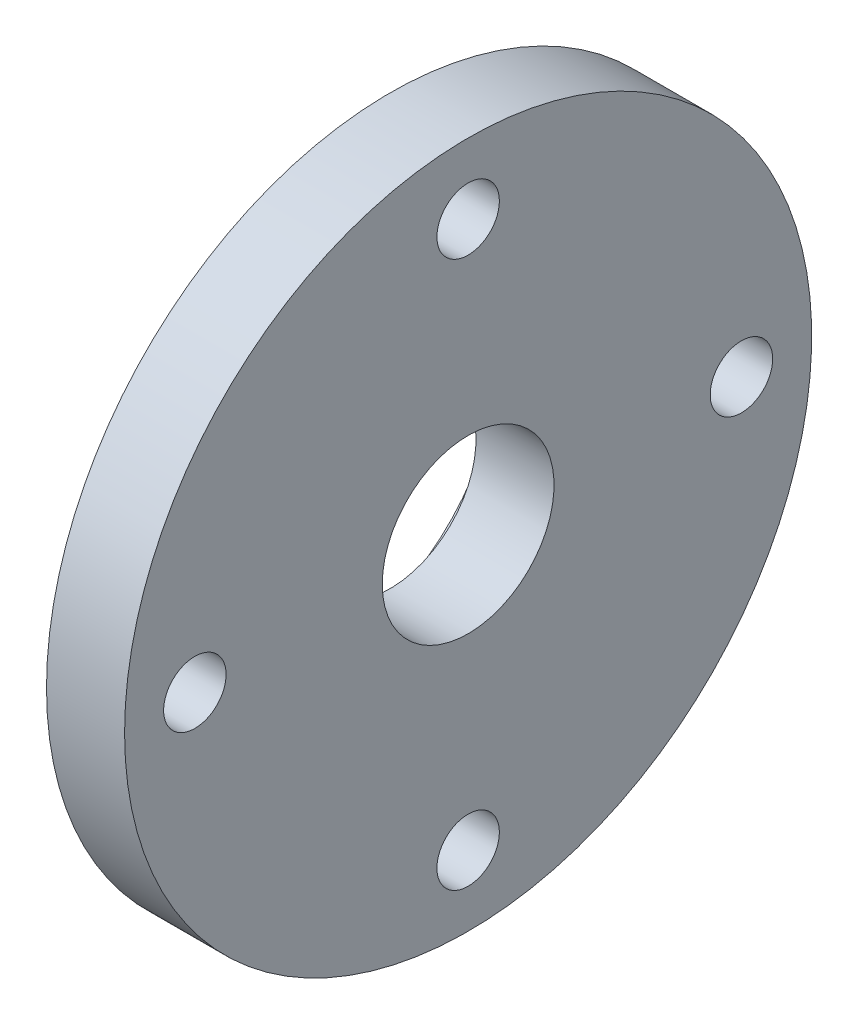
ISO-10303-21;
HEADER;
FILE_DESCRIPTION(('STEP AP214'),'2;1');
FILE_NAME('part.step','',(''),(''),'','','');
FILE_SCHEMA(('AUTOMOTIVE_DESIGN { 1 0 10303 214 1 1 1 1 }'));
ENDSEC;
DATA;
#1=APPLICATION_CONTEXT('core data for automotive mechanical design processes');
#2=APPLICATION_PROTOCOL_DEFINITION('international standard','automotive_design',2000,#1);
#3=PRODUCT_CONTEXT('',#1,'mechanical');
#4=PRODUCT('Part','Part','',(#3));
#5=PRODUCT_RELATED_PRODUCT_CATEGORY('part','',(#4));
#6=PRODUCT_DEFINITION_FORMATION('','',#4);
#7=PRODUCT_DEFINITION_CONTEXT('part definition',#1,'design');
#8=PRODUCT_DEFINITION('design','',#6,#7);
#9=PRODUCT_DEFINITION_SHAPE('','',#8);
#10=(LENGTH_UNIT() NAMED_UNIT(*) SI_UNIT(.MILLI.,.METRE.));
#11=(NAMED_UNIT(*) PLANE_ANGLE_UNIT() SI_UNIT($,.RADIAN.));
#12=(NAMED_UNIT(*) SI_UNIT($,.STERADIAN.) SOLID_ANGLE_UNIT());
#13=UNCERTAINTY_MEASURE_WITH_UNIT(LENGTH_MEASURE(1.E-05),#10,'distance_accuracy_value','');
#14=(GEOMETRIC_REPRESENTATION_CONTEXT(3) GLOBAL_UNCERTAINTY_ASSIGNED_CONTEXT((#13)) GLOBAL_UNIT_ASSIGNED_CONTEXT((#10,
#11,#12)) REPRESENTATION_CONTEXT('',''));
#15=CARTESIAN_POINT('',(0.,0.,0.));
#16=DIRECTION('',(0.,0.,1.));
#17=DIRECTION('',(1.,0.,0.));
#18=AXIS2_PLACEMENT_3D('',#15,#16,#17);
#19=CARTESIAN_POINT('',(-13.6374269005848,22.,0.));
#20=DIRECTION('',(1.,0.,0.));
#21=DIRECTION('',(0.,0.,-1.));
#22=AXIS2_PLACEMENT_3D('',#19,#20,#21);
#23=PLANE('',#22);
#24=CARTESIAN_POINT('',(-13.6374269005848,0.,0.));
#25=DIRECTION('',(-1.,0.,0.));
#26=DIRECTION('',(0.,0.,1.));
#27=AXIS2_PLACEMENT_3D('',#24,#25,#26);
#28=CIRCLE('',#27,11.);
#29=CARTESIAN_POINT('',(-13.6374269005848,0.,11.));
#30=VERTEX_POINT('',#29);
#31=EDGE_CURVE('E10',#30,#30,#28,.T.);
#32=ORIENTED_EDGE('',*,*,#31,.F.);
#33=EDGE_LOOP('',(#32));
#34=FACE_BOUND('',#33,.T.);
#35=CARTESIAN_POINT('',(-13.6374269005848,0.,0.));
#36=DIRECTION('',(-1.,0.,0.));
#37=DIRECTION('',(0.,0.,1.));
#38=AXIS2_PLACEMENT_3D('',#35,#36,#37);
#39=CIRCLE('',#38,22.);
#40=CARTESIAN_POINT('',(-13.6374269005848,0.,22.));
#41=VERTEX_POINT('',#40);
#42=EDGE_CURVE('E70',#41,#41,#39,.T.);
#43=ORIENTED_EDGE('',*,*,#42,.T.);
#44=EDGE_LOOP('',(#43));
#45=FACE_BOUND('',#44,.T.);
#46=ADVANCED_FACE('F37',(#34,#45),#23,.F.);
#47=CARTESIAN_POINT('',(-28.7719298245614,0.,0.));
#48=DIRECTION('',(-1.,0.,0.));
#49=DIRECTION('',(0.,0.,1.));
#50=AXIS2_PLACEMENT_3D('',#47,#48,#49);
#51=CYLINDRICAL_SURFACE('',#50,11.);
#52=CARTESIAN_POINT('',(-3.6374269005848,0.,0.));
#53=DIRECTION('',(-1.,0.,0.));
#54=DIRECTION('',(0.,0.,1.));
#55=AXIS2_PLACEMENT_3D('',#52,#53,#54);
#56=CIRCLE('',#55,11.);
#57=CARTESIAN_POINT('',(-3.6374269005848,0.,11.));
#58=VERTEX_POINT('',#57);
#59=EDGE_CURVE('E45',#58,#58,#56,.T.);
#60=ORIENTED_EDGE('',*,*,#59,.F.);
#61=EDGE_LOOP('',(#60));
#62=FACE_BOUND('',#61,.T.);
#63=ORIENTED_EDGE('',*,*,#31,.T.);
#64=EDGE_LOOP('',(#63));
#65=FACE_BOUND('',#64,.T.);
#66=ADVANCED_FACE('F106',(#62,#65),#51,.F.);
#67=CARTESIAN_POINT('',(-3.6374269005848,11.,0.));
#68=DIRECTION('',(-1.,0.,0.));
#69=DIRECTION('',(0.,0.,1.));
#70=AXIS2_PLACEMENT_3D('',#67,#68,#69);
#71=PLANE('',#70);
#72=CARTESIAN_POINT('',(-3.6374269005848,35.,0.));
#73=DIRECTION('',(1.,0.,0.));
#74=DIRECTION('',(0.,0.,-1.));
#75=AXIS2_PLACEMENT_3D('',#72,#73,#74);
#76=CIRCLE('',#75,4.);
#77=CARTESIAN_POINT('',(-3.6374269005848,35.,-4.));
#78=VERTEX_POINT('',#77);
#79=EDGE_CURVE('E60',#78,#78,#76,.T.);
#80=ORIENTED_EDGE('',*,*,#79,.F.);
#81=EDGE_LOOP('',(#80));
#82=FACE_BOUND('',#81,.T.);
#83=CARTESIAN_POINT('',(-3.6374269005848,9.88330434368617E-13,-35.000000000001));
#84=DIRECTION('',(1.,0.,0.));
#85=DIRECTION('',(0.,0.,-1.));
#86=AXIS2_PLACEMENT_3D('',#83,#84,#85);
#87=CIRCLE('',#86,4.00000000000077);
#88=CARTESIAN_POINT('',(-3.6374269005848,9.88330434368617E-13,-39.0000000000018));
#89=VERTEX_POINT('',#88);
#90=EDGE_CURVE('E156',#89,#89,#87,.T.);
#91=ORIENTED_EDGE('',*,*,#90,.F.);
#92=EDGE_LOOP('',(#91));
#93=FACE_BOUND('',#92,.T.);
#94=CARTESIAN_POINT('',(-3.6374269005848,-35.,-1.97666086873723E-12));
#95=DIRECTION('',(1.,0.,0.));
#96=DIRECTION('',(0.,0.,-1.));
#97=AXIS2_PLACEMENT_3D('',#94,#95,#96);
#98=CIRCLE('',#97,4.00000000000213);
#99=CARTESIAN_POINT('',(-3.6374269005848,-35.,-4.0000000000041));
#100=VERTEX_POINT('',#99);
#101=EDGE_CURVE('E160',#100,#100,#98,.T.);
#102=ORIENTED_EDGE('',*,*,#101,.F.);
#103=EDGE_LOOP('',(#102));
#104=FACE_BOUND('',#103,.T.);
#105=CARTESIAN_POINT('',(-3.6374269005848,-9.92616698165633E-13,34.999999999999));
#106=DIRECTION('',(1.,0.,0.));
#107=DIRECTION('',(0.,0.,-1.));
#108=AXIS2_PLACEMENT_3D('',#105,#106,#107);
#109=CIRCLE('',#108,4.00000000000159);
#110=CARTESIAN_POINT('',(-3.6374269005848,-9.92616698165633E-13,30.9999999999974));
#111=VERTEX_POINT('',#110);
#112=EDGE_CURVE('E84',#111,#111,#109,.T.);
#113=ORIENTED_EDGE('',*,*,#112,.F.);
#114=EDGE_LOOP('',(#113));
#115=FACE_BOUND('',#114,.T.);
#116=CARTESIAN_POINT('',(-3.6374269005848,0.,0.));
#117=DIRECTION('',(-1.,0.,0.));
#118=DIRECTION('',(0.,0.,1.));
#119=AXIS2_PLACEMENT_3D('',#116,#117,#118);
#120=CIRCLE('',#119,44.);
#121=CARTESIAN_POINT('',(-3.6374269005848,0.,44.));
#122=VERTEX_POINT('',#121);
#123=EDGE_CURVE('E51',#122,#122,#120,.T.);
#124=ORIENTED_EDGE('',*,*,#123,.F.);
#125=EDGE_LOOP('',(#124));
#126=FACE_BOUND('',#125,.T.);
#127=ORIENTED_EDGE('',*,*,#59,.T.);
#128=EDGE_LOOP('',(#127));
#129=FACE_BOUND('',#128,.T.);
#130=ADVANCED_FACE('F103',(#82,#93,#104,#115,#126,#129),#71,.F.);
#131=CARTESIAN_POINT('',(-28.7719298245614,0.,0.));
#132=DIRECTION('',(-1.,0.,0.));
#133=DIRECTION('',(0.,0.,1.));
#134=AXIS2_PLACEMENT_3D('',#131,#132,#133);
#135=CYLINDRICAL_SURFACE('',#134,44.);
#136=CARTESIAN_POINT('',(-13.6374269005848,0.,0.));
#137=DIRECTION('',(-1.,0.,0.));
#138=DIRECTION('',(0.,0.,1.));
#139=AXIS2_PLACEMENT_3D('',#136,#137,#138);
#140=CIRCLE('',#139,44.);
#141=CARTESIAN_POINT('',(-13.6374269005848,0.,44.));
#142=VERTEX_POINT('',#141);
#143=EDGE_CURVE('E94',#142,#142,#140,.T.);
#144=ORIENTED_EDGE('',*,*,#143,.F.);
#145=EDGE_LOOP('',(#144));
#146=FACE_BOUND('',#145,.T.);
#147=ORIENTED_EDGE('',*,*,#123,.T.);
#148=EDGE_LOOP('',(#147));
#149=FACE_BOUND('',#148,.T.);
#150=ADVANCED_FACE('F101',(#146,#149),#135,.T.);
#151=CARTESIAN_POINT('',(-13.6374269005848,44.,0.));
#152=DIRECTION('',(1.,0.,0.));
#153=DIRECTION('',(0.,0.,-1.));
#154=AXIS2_PLACEMENT_3D('',#151,#152,#153);
#155=PLANE('',#154);
#156=CARTESIAN_POINT('',(-13.6374269005848,35.,0.));
#157=DIRECTION('',(1.,0.,0.));
#158=DIRECTION('',(0.,0.,-1.));
#159=AXIS2_PLACEMENT_3D('',#156,#157,#158);
#160=CIRCLE('',#159,4.);
#161=CARTESIAN_POINT('',(-13.6374269005848,35.,-4.));
#162=VERTEX_POINT('',#161);
#163=EDGE_CURVE('E40',#162,#162,#160,.T.);
#164=ORIENTED_EDGE('',*,*,#163,.T.);
#165=EDGE_LOOP('',(#164));
#166=FACE_BOUND('',#165,.T.);
#167=CARTESIAN_POINT('',(-13.6374269005848,9.88330434368617E-13,-35.000000000001));
#168=DIRECTION('',(1.,0.,0.));
#169=DIRECTION('',(0.,0.,-1.));
#170=AXIS2_PLACEMENT_3D('',#167,#168,#169);
#171=CIRCLE('',#170,4.00000000000077);
#172=CARTESIAN_POINT('',(-13.6374269005848,9.88330434368617E-13,-39.0000000000018));
#173=VERTEX_POINT('',#172);
#174=EDGE_CURVE('E63',#173,#173,#171,.T.);
#175=ORIENTED_EDGE('',*,*,#174,.T.);
#176=EDGE_LOOP('',(#175));
#177=FACE_BOUND('',#176,.T.);
#178=CARTESIAN_POINT('',(-13.6374269005848,-35.,-1.97666086873723E-12));
#179=DIRECTION('',(1.,0.,0.));
#180=DIRECTION('',(0.,0.,-1.));
#181=AXIS2_PLACEMENT_3D('',#178,#179,#180);
#182=CIRCLE('',#181,4.00000000000213);
#183=CARTESIAN_POINT('',(-13.6374269005848,-35.,-4.0000000000041));
#184=VERTEX_POINT('',#183);
#185=EDGE_CURVE('E59',#184,#184,#182,.T.);
#186=ORIENTED_EDGE('',*,*,#185,.T.);
#187=EDGE_LOOP('',(#186));
#188=FACE_BOUND('',#187,.T.);
#189=CARTESIAN_POINT('',(-13.6374269005848,-9.92616698165633E-13,34.999999999999));
#190=DIRECTION('',(1.,0.,0.));
#191=DIRECTION('',(0.,0.,-1.));
#192=AXIS2_PLACEMENT_3D('',#189,#190,#191);
#193=CIRCLE('',#192,4.00000000000159);
#194=CARTESIAN_POINT('',(-13.6374269005848,-9.92616698165633E-13,30.9999999999974));
#195=VERTEX_POINT('',#194);
#196=EDGE_CURVE('E55',#195,#195,#193,.T.);
#197=ORIENTED_EDGE('',*,*,#196,.T.);
#198=EDGE_LOOP('',(#197));
#199=FACE_BOUND('',#198,.T.);
#200=CARTESIAN_POINT('',(-13.6374269005848,0.,0.));
#201=DIRECTION('',(-1.,0.,0.));
#202=DIRECTION('',(0.,0.,1.));
#203=AXIS2_PLACEMENT_3D('',#200,#201,#202);
#204=CIRCLE('',#203,26.);
#205=CARTESIAN_POINT('',(-13.6374269005848,0.,26.));
#206=VERTEX_POINT('',#205);
#207=EDGE_CURVE('E90',#206,#206,#204,.T.);
#208=ORIENTED_EDGE('',*,*,#207,.F.);
#209=EDGE_LOOP('',(#208));
#210=FACE_BOUND('',#209,.T.);
#211=ORIENTED_EDGE('',*,*,#143,.T.);
#212=EDGE_LOOP('',(#211));
#213=FACE_BOUND('',#212,.T.);
#214=ADVANCED_FACE('F119',(#166,#177,#188,#199,#210,#213),#155,.F.);
#215=CARTESIAN_POINT('',(-28.7719298245614,0.,0.));
#216=DIRECTION('',(-1.,0.,0.));
#217=DIRECTION('',(0.,0.,1.));
#218=AXIS2_PLACEMENT_3D('',#215,#216,#217);
#219=CYLINDRICAL_SURFACE('',#218,26.);
#220=CARTESIAN_POINT('',(-21.6374269005848,0.,0.));
#221=DIRECTION('',(-1.,0.,0.));
#222=DIRECTION('',(0.,0.,1.));
#223=AXIS2_PLACEMENT_3D('',#220,#221,#222);
#224=CIRCLE('',#223,26.);
#225=CARTESIAN_POINT('',(-21.6374269005848,0.,26.));
#226=VERTEX_POINT('',#225);
#227=EDGE_CURVE('E81',#226,#226,#224,.T.);
#228=ORIENTED_EDGE('',*,*,#227,.F.);
#229=EDGE_LOOP('',(#228));
#230=FACE_BOUND('',#229,.T.);
#231=ORIENTED_EDGE('',*,*,#207,.T.);
#232=EDGE_LOOP('',(#231));
#233=FACE_BOUND('',#232,.T.);
#234=ADVANCED_FACE('F123',(#230,#233),#219,.T.);
#235=CARTESIAN_POINT('',(-21.6374269005848,26.,0.));
#236=DIRECTION('',(1.,0.,0.));
#237=DIRECTION('',(0.,0.,-1.));
#238=AXIS2_PLACEMENT_3D('',#235,#236,#237);
#239=PLANE('',#238);
#240=CARTESIAN_POINT('',(-21.6374269005848,0.,0.));
#241=DIRECTION('',(-1.,0.,0.));
#242=DIRECTION('',(0.,0.,1.));
#243=AXIS2_PLACEMENT_3D('',#240,#241,#242);
#244=CIRCLE('',#243,22.);
#245=CARTESIAN_POINT('',(-21.6374269005848,0.,22.));
#246=VERTEX_POINT('',#245);
#247=EDGE_CURVE('E75',#246,#246,#244,.T.);
#248=ORIENTED_EDGE('',*,*,#247,.F.);
#249=EDGE_LOOP('',(#248));
#250=FACE_BOUND('',#249,.T.);
#251=ORIENTED_EDGE('',*,*,#227,.T.);
#252=EDGE_LOOP('',(#251));
#253=FACE_BOUND('',#252,.T.);
#254=ADVANCED_FACE('F126',(#250,#253),#239,.F.);
#255=CARTESIAN_POINT('',(-28.7719298245614,0.,0.));
#256=DIRECTION('',(-1.,0.,0.));
#257=DIRECTION('',(0.,0.,1.));
#258=AXIS2_PLACEMENT_3D('',#255,#256,#257);
#259=CYLINDRICAL_SURFACE('',#258,22.);
#260=ORIENTED_EDGE('',*,*,#42,.F.);
#261=EDGE_LOOP('',(#260));
#262=FACE_BOUND('',#261,.T.);
#263=ORIENTED_EDGE('',*,*,#247,.T.);
#264=EDGE_LOOP('',(#263));
#265=FACE_BOUND('',#264,.T.);
#266=ADVANCED_FACE('F130',(#262,#265),#259,.F.);
#267=CARTESIAN_POINT('',(-21.6374269005848,-9.92616698165633E-13,34.999999999999));
#268=DIRECTION('',(1.,0.,0.));
#269=DIRECTION('',(0.,0.,-1.));
#270=AXIS2_PLACEMENT_3D('',#267,#268,#269);
#271=CYLINDRICAL_SURFACE('',#270,4.00000000000159);
#272=ORIENTED_EDGE('',*,*,#112,.T.);
#273=EDGE_LOOP('',(#272));
#274=FACE_BOUND('',#273,.T.);
#275=ORIENTED_EDGE('',*,*,#196,.F.);
#276=EDGE_LOOP('',(#275));
#277=FACE_BOUND('',#276,.T.);
#278=ADVANCED_FACE('F134',(#274,#277),#271,.F.);
#279=CARTESIAN_POINT('',(-21.6374269005848,-35.,-1.97666086873723E-12));
#280=DIRECTION('',(1.,0.,0.));
#281=DIRECTION('',(0.,0.,-1.));
#282=AXIS2_PLACEMENT_3D('',#279,#280,#281);
#283=CYLINDRICAL_SURFACE('',#282,4.00000000000213);
#284=ORIENTED_EDGE('',*,*,#101,.T.);
#285=EDGE_LOOP('',(#284));
#286=FACE_BOUND('',#285,.T.);
#287=ORIENTED_EDGE('',*,*,#185,.F.);
#288=EDGE_LOOP('',(#287));
#289=FACE_BOUND('',#288,.T.);
#290=ADVANCED_FACE('F138',(#286,#289),#283,.F.);
#291=CARTESIAN_POINT('',(-21.6374269005848,9.88330434368617E-13,-35.000000000001));
#292=DIRECTION('',(1.,0.,0.));
#293=DIRECTION('',(0.,0.,-1.));
#294=AXIS2_PLACEMENT_3D('',#291,#292,#293);
#295=CYLINDRICAL_SURFACE('',#294,4.00000000000077);
#296=ORIENTED_EDGE('',*,*,#90,.T.);
#297=EDGE_LOOP('',(#296));
#298=FACE_BOUND('',#297,.T.);
#299=ORIENTED_EDGE('',*,*,#174,.F.);
#300=EDGE_LOOP('',(#299));
#301=FACE_BOUND('',#300,.T.);
#302=ADVANCED_FACE('F142',(#298,#301),#295,.F.);
#303=CARTESIAN_POINT('',(-21.6374269005848,35.,0.));
#304=DIRECTION('',(1.,0.,0.));
#305=DIRECTION('',(0.,0.,-1.));
#306=AXIS2_PLACEMENT_3D('',#303,#304,#305);
#307=CYLINDRICAL_SURFACE('',#306,4.);
#308=ORIENTED_EDGE('',*,*,#79,.T.);
#309=EDGE_LOOP('',(#308));
#310=FACE_BOUND('',#309,.T.);
#311=ORIENTED_EDGE('',*,*,#163,.F.);
#312=EDGE_LOOP('',(#311));
#313=FACE_BOUND('',#312,.T.);
#314=ADVANCED_FACE('F146',(#310,#313),#307,.F.);
#315=CLOSED_SHELL('',(#46,#66,#130,#150,#214,#234,#254,#266,#278,#290,#302,#314));
#316=MANIFOLD_SOLID_BREP('B2',#315);
#317=ADVANCED_BREP_SHAPE_REPRESENTATION('',(#18,#316),#14);
#318=SHAPE_DEFINITION_REPRESENTATION(#9,#317);
ENDSEC;
END-ISO-10303-21;
